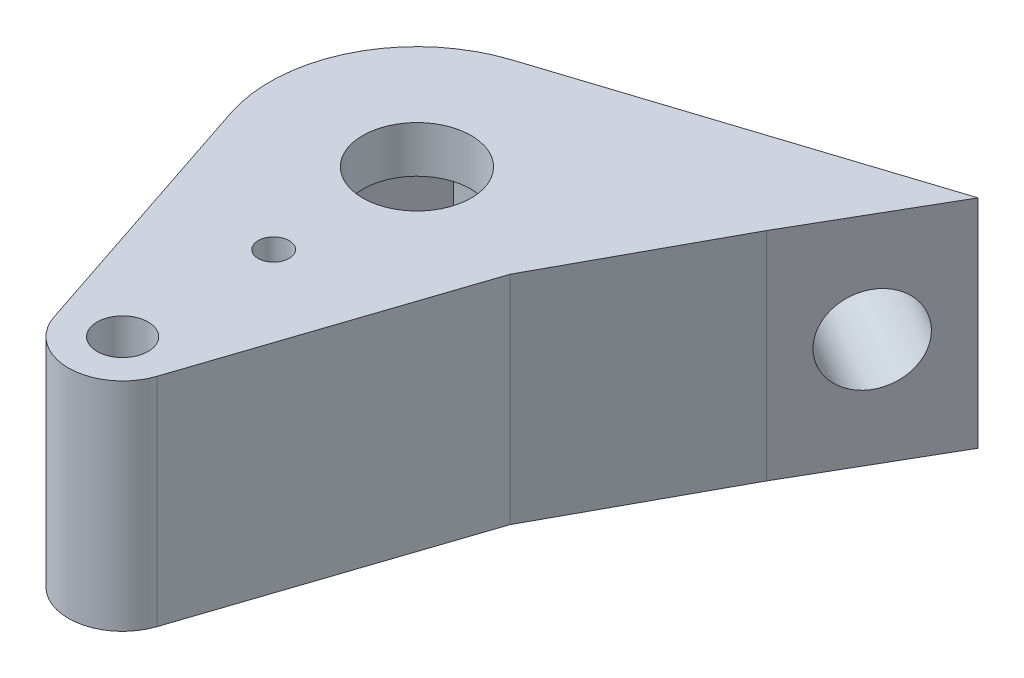
ISO-10303-21;
HEADER;
FILE_DESCRIPTION(('STEP AP214'),'2;1');
FILE_NAME('part.step','',(''),(''),'','','');
FILE_SCHEMA(('AUTOMOTIVE_DESIGN { 1 0 10303 214 1 1 1 1 }'));
ENDSEC;
DATA;
#1=APPLICATION_CONTEXT('core data for automotive mechanical design processes');
#2=APPLICATION_PROTOCOL_DEFINITION('international standard','automotive_design',2000,#1);
#3=PRODUCT_CONTEXT('',#1,'mechanical');
#4=PRODUCT('Part','Part','',(#3));
#5=PRODUCT_RELATED_PRODUCT_CATEGORY('part','',(#4));
#6=PRODUCT_DEFINITION_FORMATION('','',#4);
#7=PRODUCT_DEFINITION_CONTEXT('part definition',#1,'design');
#8=PRODUCT_DEFINITION('design','',#6,#7);
#9=PRODUCT_DEFINITION_SHAPE('','',#8);
#10=(LENGTH_UNIT() NAMED_UNIT(*) SI_UNIT(.MILLI.,.METRE.));
#11=(NAMED_UNIT(*) PLANE_ANGLE_UNIT() SI_UNIT($,.RADIAN.));
#12=(NAMED_UNIT(*) SI_UNIT($,.STERADIAN.) SOLID_ANGLE_UNIT());
#13=UNCERTAINTY_MEASURE_WITH_UNIT(LENGTH_MEASURE(1.E-05),#10,'distance_accuracy_value','');
#14=(GEOMETRIC_REPRESENTATION_CONTEXT(3) GLOBAL_UNCERTAINTY_ASSIGNED_CONTEXT((#13)) GLOBAL_UNIT_ASSIGNED_CONTEXT((#10,
#11,#12)) REPRESENTATION_CONTEXT('',''));
#15=CARTESIAN_POINT('',(0.,0.,0.));
#16=DIRECTION('',(0.,0.,1.));
#17=DIRECTION('',(1.,0.,0.));
#18=AXIS2_PLACEMENT_3D('',#15,#16,#17);
#19=CARTESIAN_POINT('',(0.,14.,-18.75));
#20=DIRECTION('',(0.,-1.,0.));
#21=DIRECTION('',(0.,0.,-1.));
#22=AXIS2_PLACEMENT_3D('',#19,#20,#21);
#23=CYLINDRICAL_SURFACE('',#22,1.);
#24=CARTESIAN_POINT('',(0.,14.,-18.75));
#25=DIRECTION('',(0.,1.,0.));
#26=DIRECTION('',(0.,0.,1.));
#27=AXIS2_PLACEMENT_3D('',#24,#25,#26);
#28=CIRCLE('',#27,1.);
#29=CARTESIAN_POINT('',(0.,14.,-17.75));
#30=VERTEX_POINT('',#29);
#31=EDGE_CURVE('E244',#30,#30,#28,.T.);
#32=ORIENTED_EDGE('',*,*,#31,.T.);
#33=EDGE_LOOP('',(#32));
#34=FACE_BOUND('',#33,.T.);
#35=CARTESIAN_POINT('',(0.,0.,-18.75));
#36=DIRECTION('',(0.,1.,0.));
#37=DIRECTION('',(0.,0.,1.));
#38=AXIS2_PLACEMENT_3D('',#35,#36,#37);
#39=CIRCLE('',#38,1.);
#40=CARTESIAN_POINT('',(0.,0.,-17.75));
#41=VERTEX_POINT('',#40);
#42=EDGE_CURVE('E247',#41,#41,#39,.T.);
#43=ORIENTED_EDGE('',*,*,#42,.F.);
#44=EDGE_LOOP('',(#43));
#45=FACE_BOUND('',#44,.T.);
#46=CARTESIAN_POINT('',(-0.300705799504268,8.73205080756888,-17.7962830492518));
#47=CARTESIAN_POINT('',(-0.325689996070135,8.73204560715963,-17.8041584912273));
#48=CARTESIAN_POINT('',(-0.35034909273251,8.73264583606228,-17.8130155199476));
#49=CARTESIAN_POINT('',(-0.398836042356316,8.73500666353457,-17.8326054373541));
#50=CARTESIAN_POINT('',(-0.422664396574327,8.73676654916548,-17.8433371705242));
#51=CARTESIAN_POINT('',(-0.492370233492586,8.74368070611668,-17.8780767802166));
#52=CARTESIAN_POINT('',(-0.536801699557979,8.75047082385879,-17.9047350611238));
#53=CARTESIAN_POINT('',(-0.62047026793531,8.76748638758361,-17.964093098129));
#54=CARTESIAN_POINT('',(-0.659717715065584,8.7777048433623,-17.9967805005877));
#55=CARTESIAN_POINT('',(-0.732528814921963,8.80040804540741,-18.0673749373079));
#56=CARTESIAN_POINT('',(-0.766083525729774,8.81289629440181,-18.1052900167418));
#57=CARTESIAN_POINT('',(-0.829461955250505,8.83997024460583,-18.1887864066669));
#58=CARTESIAN_POINT('',(-0.8587560633284,8.8546439549019,-18.2347410989531));
#59=CARTESIAN_POINT('',(-0.909549704299497,8.88372311011787,-18.330863528057));
#60=CARTESIAN_POINT('',(-0.931047124220398,8.89812848131355,-18.3810324024257));
#61=CARTESIAN_POINT('',(-0.966861891057181,8.92621470693834,-18.488131138555));
#62=CARTESIAN_POINT('',(-0.980596394408451,8.93978095819954,-18.5452887847199));
#63=CARTESIAN_POINT('',(-0.997840713747346,8.96350748441406,-18.6618176911083));
#64=CARTESIAN_POINT('',(-1.00135691241316,8.97366988201096,-18.7211875460302));
#65=CARTESIAN_POINT('',(-0.997830162807191,8.988804552762,-18.8359877111331));
#66=CARTESIAN_POINT('',(-0.991520854125792,8.99409471615473,-18.8913977004423));
#67=CARTESIAN_POINT('',(-0.969683926093178,9.00007582641124,-19.0006173700762));
#68=CARTESIAN_POINT('',(-0.954161740173439,9.00076948120356,-19.0544279740358));
#69=CARTESIAN_POINT('',(-0.916162517648001,8.99762980490607,-19.1540280424958));
#70=CARTESIAN_POINT('',(-0.894407649166108,8.9941848927311,-19.2001081079656));
#71=CARTESIAN_POINT('',(-0.844380234395861,8.98374231889361,-19.2881310817435));
#72=CARTESIAN_POINT('',(-0.81610732475216,8.97674445914197,-19.3300737592223));
#73=CARTESIAN_POINT('',(-0.753503173972858,8.95971589715707,-19.4094113808581));
#74=CARTESIAN_POINT('',(-0.719093513708405,8.94964456758859,-19.446735364114));
#75=CARTESIAN_POINT('',(-0.645422534654073,8.92737663794528,-19.5154875859152));
#76=CARTESIAN_POINT('',(-0.606159409817176,8.9151792460342,-19.5469136187238));
#77=CARTESIAN_POINT('',(-0.519733669081448,8.88844485919106,-19.6060797629524));
#78=CARTESIAN_POINT('',(-0.472175205580875,8.87379569933289,-19.6331914085517));
#79=CARTESIAN_POINT('',(-0.373230074335903,8.84454526337434,-19.6793454646563));
#80=CARTESIAN_POINT('',(-0.321840017300622,8.8299440418869,-19.6983806289989));
#81=CARTESIAN_POINT('',(-0.212831005686062,8.80143165596162,-19.7288295924018));
#82=CARTESIAN_POINT('',(-0.155023953401311,8.78762487792891,-19.7396760214373));
#83=CARTESIAN_POINT('',(-0.0377111981412017,8.76373998438613,-19.7510156246));
#84=CARTESIAN_POINT('',(0.0217900697548402,8.75365295265307,-19.7515337161523));
#85=CARTESIAN_POINT('',(0.118188488170374,8.74164806229026,-19.7436870182192));
#86=CARTESIAN_POINT('',(0.155169496554423,8.73808457362709,-19.7385901882888));
#87=CARTESIAN_POINT('',(0.228538587916785,8.73327051759961,-19.7242567576602));
#88=CARTESIAN_POINT('',(0.264925512373413,8.73202403336765,-19.715012884356));
#89=CARTESIAN_POINT('',(0.300705799504267,8.73205080756888,-19.7037169507482));
#90=B_SPLINE_CURVE_WITH_KNOTS('',3,(#46,#47,#48,#49,#50,#51,#52,#53,#54,#55,#56,#57,#58,#59,#60,
#61,#62,#63,#64,#65,#66,#67,#68,#69,#70,#71,#72,#73,#74,#75,#76,#77,#78,#79,#80,#81,#82,#83,#84,
#85,#86,#87,#88,#89),.UNSPECIFIED.,.F.,.F.,(4,2,2,2,2,2,2,2,2,2,2,2,2,2,2,2,2,2,2,2,2,4),(0.,
0.0785326222006874,0.157017008768958,0.312951858899485,0.46857067885041,0.624431719704137,
0.79304038253853,0.961694705745681,1.14173722727347,1.32166726431662,1.48879248123988,
1.65581923138171,1.80832142369327,1.96083211946322,2.11545319823069,2.27013198801097,
2.43941995018337,2.60885947680376,2.7891706621282,2.96904678850595,3.08126318733152,
3.19367715228912),.UNSPECIFIED.);
#91=CARTESIAN_POINT('',(-0.300705799504267,8.73205080756888,-17.7962830492518));
#92=VERTEX_POINT('',#91);
#93=CARTESIAN_POINT('',(0.300705799504268,8.73205080756888,-19.7037169507482));
#94=VERTEX_POINT('',#93);
#95=EDGE_CURVE('E64',#92,#94,#90,.T.);
#96=ORIENTED_EDGE('',*,*,#95,.T.);
#97=DIRECTION('',(0.,-1.,0.));
#98=VECTOR('',#97,1.);
#99=CARTESIAN_POINT('',(0.300705799504268,14.,-19.7037169507482));
#100=LINE('',#99,#98);
#101=CARTESIAN_POINT('',(0.300705799504268,5.26794919243112,-19.7037169507482));
#102=VERTEX_POINT('',#101);
#103=EDGE_CURVE('E12',#94,#102,#100,.T.);
#104=ORIENTED_EDGE('',*,*,#103,.T.);
#105=CARTESIAN_POINT('',(0.300705799504268,5.26794919243112,-19.7037169507482));
#106=CARTESIAN_POINT('',(0.275722775869407,5.26795439284037,-19.7115961127856));
#107=CARTESIAN_POINT('',(0.250443043458027,5.26735416393772,-19.7184847363903));
#108=CARTESIAN_POINT('',(0.19948854453796,5.26499333646543,-19.7302485872741));
#109=CARTESIAN_POINT('',(0.173814030200645,5.26323345083452,-19.7351250486055));
#110=CARTESIAN_POINT('',(0.0967885298625965,5.25631929388332,-19.7466496518406));
#111=CARTESIAN_POINT('',(0.0451018418423783,5.24952917614122,-19.7502973085059));
#112=CARTESIAN_POINT('',(-0.057481808320916,5.23251361241639,-19.7496643704326));
#113=CARTESIAN_POINT('',(-0.108380158686597,5.22229515663771,-19.7453998287469));
#114=CARTESIAN_POINT('',(-0.208514825421081,5.1995919545926,-19.7293349827745));
#115=CARTESIAN_POINT('',(-0.257748431520477,5.18710370559819,-19.7175229593948));
#116=CARTESIAN_POINT('',(-0.357556563407659,5.16002975539417,-19.6854790946429));
#117=CARTESIAN_POINT('',(-0.407911420560412,5.1453560450981,-19.6646376246294));
#118=CARTESIAN_POINT('',(-0.50465269573758,5.11627688988213,-19.6150327759044));
#119=CARTESIAN_POINT('',(-0.551038035388847,5.10187151868645,-19.5862672534146));
#120=CARTESIAN_POINT('',(-0.641805086265707,5.07378529306166,-19.5190796111045));
#121=CARTESIAN_POINT('',(-0.685840011760628,5.06021904180046,-19.4801365958891));
#122=CARTESIAN_POINT('',(-0.766803966057644,5.03649251558594,-19.3945726392359));
#123=CARTESIAN_POINT('',(-0.803737417195639,5.02633011798904,-19.3479565099078));
#124=CARTESIAN_POINT('',(-0.866695142638442,5.011195447238,-19.2518948595081));
#125=CARTESIAN_POINT('',(-0.893308723740223,5.00590528384527,-19.2028867827022));
#126=CARTESIAN_POINT('',(-0.938066788389363,4.99992417358876,-19.1008941196832));
#127=CARTESIAN_POINT('',(-0.956216252518446,4.99923051879645,-19.047911893361));
#128=CARTESIAN_POINT('',(-0.982217364032968,5.00237019509393,-18.9445288350304));
#129=CARTESIAN_POINT('',(-0.990827258781729,5.0058151072689,-18.8943041752628));
#130=CARTESIAN_POINT('',(-1.00033510331877,5.01625768110639,-18.7935054300644));
#131=CARTESIAN_POINT('',(-1.00123262306545,5.02325554085803,-18.7429313253059));
#132=CARTESIAN_POINT('',(-0.995456495260028,5.04028410284293,-18.6420334846492));
#133=CARTESIAN_POINT('',(-0.988677909017469,5.05035543241141,-18.5917228971536));
#134=CARTESIAN_POINT('',(-0.96776483029224,5.07262336205472,-18.4931484364873));
#135=CARTESIAN_POINT('',(-0.953627593223961,5.0848207539658,-18.4448853342442));
#136=CARTESIAN_POINT('',(-0.916768077180377,5.11155514080894,-18.3468474978665));
#137=CARTESIAN_POINT('',(-0.893361065647085,5.12620430066711,-18.2973605239368));
#138=CARTESIAN_POINT('',(-0.838782838138934,5.15545473662566,-18.2028007387527));
#139=CARTESIAN_POINT('',(-0.807604689591339,5.1700559581131,-18.1577319191899));
#140=CARTESIAN_POINT('',(-0.735774542800553,5.19856834403838,-18.07026458816));
#141=CARTESIAN_POINT('',(-0.694643033860512,5.21237512207109,-18.0282229505968));
#142=CARTESIAN_POINT('',(-0.605050179739718,5.23626001561387,-17.9516462593841));
#143=CARTESIAN_POINT('',(-0.556606759611163,5.24634704734694,-17.9170933384317));
#144=CARTESIAN_POINT('',(-0.47314111706229,5.25835193770975,-17.8682291157798));
#145=CARTESIAN_POINT('',(-0.439924626896421,5.26191542637291,-17.8511927594351));
#146=CARTESIAN_POINT('',(-0.371602867658686,5.26672948240039,-17.8208512364743));
#147=CARTESIAN_POINT('',(-0.336494376196765,5.26797596663235,-17.8075526917289));
#148=CARTESIAN_POINT('',(-0.300705799504267,5.26794919243112,-17.7962830492518));
#149=B_SPLINE_CURVE_WITH_KNOTS('',3,(#105,#106,#107,#108,#109,#110,#111,#112,#113,#114,#115,
#116,#117,#118,#119,#120,#121,#122,#123,#124,#125,#126,#127,#128,#129,#130,#131,#132,#133,#134,
#135,#136,#137,#138,#139,#140,#141,#142,#143,#144,#145,#146,#147,#148),.UNSPECIFIED.,.F.,.F.,(4,
2,2,2,2,2,2,2,2,2,2,2,2,2,2,2,2,2,2,2,2,4),(0.,0.0785326222006874,0.157017008768958,
0.312951858899485,0.468570678850407,0.624431719704135,0.793040382538526,0.961694705745679,
1.14173722727346,1.32166726431661,1.48879248123988,1.65581923138171,1.80832142369327,
1.96083211946322,2.11545319823069,2.27013198801097,2.43941995018337,2.60885947680376,
2.7891706621282,2.96904678850596,3.08126318733153,3.19367715228912),.UNSPECIFIED.);
#150=CARTESIAN_POINT('',(-0.300705799504267,5.26794919243112,-17.7962830492518));
#151=VERTEX_POINT('',#150);
#152=EDGE_CURVE('E180',#102,#151,#149,.T.);
#153=ORIENTED_EDGE('',*,*,#152,.T.);
#154=DIRECTION('',(0.,-1.,0.));
#155=VECTOR('',#154,1.);
#156=CARTESIAN_POINT('',(-0.300705799504267,14.,-17.7962830492518));
#157=LINE('',#156,#155);
#158=EDGE_CURVE('E183',#151,#92,#157,.F.);
#159=ORIENTED_EDGE('',*,*,#158,.T.);
#160=EDGE_LOOP('',(#96,#104,#153,#159));
#161=FACE_BOUND('',#160,.T.);
#162=ADVANCED_FACE('F55',(#34,#45,#161),#23,.F.);
#163=CARTESIAN_POINT('',(-6.40858798800484,14.,-28.));
#164=DIRECTION('',(0.866025403784439,0.,-0.5));
#165=DIRECTION('',(-0.5,0.,-0.866025403784439));
#166=AXIS2_PLACEMENT_3D('',#163,#164,#165);
#167=PLANE('',#166);
#168=DIRECTION('',(0.,-1.,0.));
#169=VECTOR('',#168,1.);
#170=CARTESIAN_POINT('',(-6.40858798800484,14.,-28.));
#171=LINE('',#170,#169);
#172=CARTESIAN_POINT('',(-6.40858798800484,11.,-28.));
#173=VERTEX_POINT('',#172);
#174=CARTESIAN_POINT('',(-6.40858798800484,0.,-28.));
#175=VERTEX_POINT('',#174);
#176=EDGE_CURVE('E274',#173,#175,#171,.T.);
#177=ORIENTED_EDGE('',*,*,#176,.F.);
#178=DIRECTION('',(0.5,0.,0.866025403784439));
#179=VECTOR('',#178,1.);
#180=CARTESIAN_POINT('',(-6.40858798800484,11.,-28.));
#181=LINE('',#180,#179);
#182=CARTESIAN_POINT('',(-3.20429399400243,11.,-22.45));
#183=VERTEX_POINT('',#182);
#184=EDGE_CURVE('E429',#173,#183,#181,.T.);
#185=ORIENTED_EDGE('',*,*,#184,.T.);
#186=DIRECTION('',(0.,-1.,0.));
#187=VECTOR('',#186,1.);
#188=CARTESIAN_POINT('',(-3.20429399400243,14.,-22.45));
#189=LINE('',#188,#187);
#190=CARTESIAN_POINT('',(-3.20429399400243,0.,-22.45));
#191=VERTEX_POINT('',#190);
#192=EDGE_CURVE('E284',#183,#191,#189,.T.);
#193=ORIENTED_EDGE('',*,*,#192,.T.);
#194=DIRECTION('',(0.5,0.,0.866025403784439));
#195=VECTOR('',#194,1.);
#196=CARTESIAN_POINT('',(-6.40858798800484,0.,-28.));
#197=LINE('',#196,#195);
#198=EDGE_CURVE('E251',#175,#191,#197,.T.);
#199=ORIENTED_EDGE('',*,*,#198,.F.);
#200=EDGE_LOOP('',(#177,#185,#193,#199));
#201=FACE_BOUND('',#200,.T.);
#202=ADVANCED_FACE('F233',(#201),#167,.T.);
#203=CARTESIAN_POINT('',(-3.20429399400243,14.,-22.45));
#204=DIRECTION('',(0.,0.,-1.));
#205=DIRECTION('',(-1.,0.,0.));
#206=AXIS2_PLACEMENT_3D('',#203,#204,#205);
#207=PLANE('',#206);
#208=ORIENTED_EDGE('',*,*,#192,.F.);
#209=DIRECTION('',(1.,0.,0.));
#210=VECTOR('',#209,1.);
#211=CARTESIAN_POINT('',(-3.20429399400243,11.,-22.45));
#212=LINE('',#211,#210);
#213=CARTESIAN_POINT('',(3.20429399400243,11.,-22.45));
#214=VERTEX_POINT('',#213);
#215=EDGE_CURVE('E433',#183,#214,#212,.T.);
#216=ORIENTED_EDGE('',*,*,#215,.T.);
#217=DIRECTION('',(0.,-1.,0.));
#218=VECTOR('',#217,1.);
#219=CARTESIAN_POINT('',(3.20429399400243,14.,-22.45));
#220=LINE('',#219,#218);
#221=CARTESIAN_POINT('',(3.20429399400243,0.,-22.45));
#222=VERTEX_POINT('',#221);
#223=EDGE_CURVE('E282',#214,#222,#220,.T.);
#224=ORIENTED_EDGE('',*,*,#223,.T.);
#225=DIRECTION('',(1.,0.,0.));
#226=VECTOR('',#225,1.);
#227=CARTESIAN_POINT('',(-3.20429399400243,0.,-22.45));
#228=LINE('',#227,#226);
#229=EDGE_CURVE('E259',#191,#222,#228,.T.);
#230=ORIENTED_EDGE('',*,*,#229,.F.);
#231=EDGE_LOOP('',(#208,#216,#224,#230));
#232=FACE_BOUND('',#231,.T.);
#233=ADVANCED_FACE('F238',(#232),#207,.T.);
#234=CARTESIAN_POINT('',(3.20429399400243,14.,-22.45));
#235=DIRECTION('',(-0.866025403784438,0.,-0.5));
#236=DIRECTION('',(-0.5,0.,0.866025403784439));
#237=AXIS2_PLACEMENT_3D('',#234,#235,#236);
#238=PLANE('',#237);
#239=ORIENTED_EDGE('',*,*,#223,.F.);
#240=DIRECTION('',(0.5,0.,-0.866025403784438));
#241=VECTOR('',#240,1.);
#242=CARTESIAN_POINT('',(3.20429399400243,11.,-22.45));
#243=LINE('',#242,#241);
#244=CARTESIAN_POINT('',(6.40858798800485,11.,-28.));
#245=VERTEX_POINT('',#244);
#246=EDGE_CURVE('E436',#214,#245,#243,.T.);
#247=ORIENTED_EDGE('',*,*,#246,.T.);
#248=DIRECTION('',(0.,-1.,0.));
#249=VECTOR('',#248,1.);
#250=CARTESIAN_POINT('',(6.40858798800485,14.,-28.));
#251=LINE('',#250,#249);
#252=CARTESIAN_POINT('',(6.40858798800485,0.,-28.));
#253=VERTEX_POINT('',#252);
#254=EDGE_CURVE('E280',#245,#253,#251,.T.);
#255=ORIENTED_EDGE('',*,*,#254,.T.);
#256=DIRECTION('',(0.5,0.,-0.866025403784438));
#257=VECTOR('',#256,1.);
#258=CARTESIAN_POINT('',(3.20429399400243,0.,-22.45));
#259=LINE('',#258,#257);
#260=EDGE_CURVE('E262',#222,#253,#259,.T.);
#261=ORIENTED_EDGE('',*,*,#260,.F.);
#262=EDGE_LOOP('',(#239,#247,#255,#261));
#263=FACE_BOUND('',#262,.T.);
#264=ADVANCED_FACE('F460',(#263),#238,.T.);
#265=CARTESIAN_POINT('',(6.40858798800485,14.,-28.));
#266=DIRECTION('',(-0.866025403784439,0.,0.5));
#267=DIRECTION('',(0.5,0.,0.866025403784439));
#268=AXIS2_PLACEMENT_3D('',#265,#266,#267);
#269=PLANE('',#268);
#270=ORIENTED_EDGE('',*,*,#254,.F.);
#271=DIRECTION('',(-0.5,0.,-0.866025403784439));
#272=VECTOR('',#271,1.);
#273=CARTESIAN_POINT('',(6.40858798800485,11.,-28.));
#274=LINE('',#273,#272);
#275=CARTESIAN_POINT('',(3.20429399400243,11.,-33.55));
#276=VERTEX_POINT('',#275);
#277=EDGE_CURVE('E439',#245,#276,#274,.T.);
#278=ORIENTED_EDGE('',*,*,#277,.T.);
#279=DIRECTION('',(0.,-1.,0.));
#280=VECTOR('',#279,1.);
#281=CARTESIAN_POINT('',(3.20429399400243,14.,-33.55));
#282=LINE('',#281,#280);
#283=CARTESIAN_POINT('',(3.20429399400243,0.,-33.55));
#284=VERTEX_POINT('',#283);
#285=EDGE_CURVE('E278',#276,#284,#282,.T.);
#286=ORIENTED_EDGE('',*,*,#285,.T.);
#287=DIRECTION('',(-0.5,0.,-0.866025403784439));
#288=VECTOR('',#287,1.);
#289=CARTESIAN_POINT('',(6.40858798800485,0.,-28.));
#290=LINE('',#289,#288);
#291=EDGE_CURVE('E265',#253,#284,#290,.T.);
#292=ORIENTED_EDGE('',*,*,#291,.F.);
#293=EDGE_LOOP('',(#270,#278,#286,#292));
#294=FACE_BOUND('',#293,.T.);
#295=ADVANCED_FACE('F457',(#294),#269,.T.);
#296=CARTESIAN_POINT('',(3.20429399400243,14.,-33.55));
#297=DIRECTION('',(0.,0.,1.));
#298=DIRECTION('',(1.,0.,0.));
#299=AXIS2_PLACEMENT_3D('',#296,#297,#298);
#300=PLANE('',#299);
#301=ORIENTED_EDGE('',*,*,#285,.F.);
#302=DIRECTION('',(-1.,0.,0.));
#303=VECTOR('',#302,1.);
#304=CARTESIAN_POINT('',(3.20429399400243,11.,-33.55));
#305=LINE('',#304,#303);
#306=CARTESIAN_POINT('',(-3.20429399400242,11.,-33.55));
#307=VERTEX_POINT('',#306);
#308=EDGE_CURVE('E254',#276,#307,#305,.T.);
#309=ORIENTED_EDGE('',*,*,#308,.T.);
#310=DIRECTION('',(0.,-1.,0.));
#311=VECTOR('',#310,1.);
#312=CARTESIAN_POINT('',(-3.20429399400242,14.,-33.55));
#313=LINE('',#312,#311);
#314=CARTESIAN_POINT('',(-3.20429399400242,0.,-33.55));
#315=VERTEX_POINT('',#314);
#316=EDGE_CURVE('E276',#307,#315,#313,.T.);
#317=ORIENTED_EDGE('',*,*,#316,.T.);
#318=DIRECTION('',(-1.,0.,0.));
#319=VECTOR('',#318,1.);
#320=CARTESIAN_POINT('',(3.20429399400243,0.,-33.55));
#321=LINE('',#320,#319);
#322=EDGE_CURVE('E268',#284,#315,#321,.T.);
#323=ORIENTED_EDGE('',*,*,#322,.F.);
#324=EDGE_LOOP('',(#301,#309,#317,#323));
#325=FACE_BOUND('',#324,.T.);
#326=ADVANCED_FACE('F446',(#325),#300,.T.);
#327=CARTESIAN_POINT('',(-3.20429399400242,14.,-33.55));
#328=DIRECTION('',(0.866025403784438,0.,0.5));
#329=DIRECTION('',(0.5,0.,-0.866025403784438));
#330=AXIS2_PLACEMENT_3D('',#327,#328,#329);
#331=PLANE('',#330);
#332=ORIENTED_EDGE('',*,*,#316,.F.);
#333=DIRECTION('',(-0.5,0.,0.866025403784438));
#334=VECTOR('',#333,1.);
#335=CARTESIAN_POINT('',(-3.20429399400242,11.,-33.55));
#336=LINE('',#335,#334);
#337=EDGE_CURVE('E249',#307,#173,#336,.T.);
#338=ORIENTED_EDGE('',*,*,#337,.T.);
#339=ORIENTED_EDGE('',*,*,#176,.T.);
#340=DIRECTION('',(-0.5,0.,0.866025403784438));
#341=VECTOR('',#340,1.);
#342=CARTESIAN_POINT('',(-3.20429399400242,0.,-33.55));
#343=LINE('',#342,#341);
#344=EDGE_CURVE('E271',#315,#175,#343,.T.);
#345=ORIENTED_EDGE('',*,*,#344,.F.);
#346=EDGE_LOOP('',(#332,#338,#339,#345));
#347=FACE_BOUND('',#346,.T.);
#348=ADVANCED_FACE('F450',(#347),#331,.T.);
#349=CARTESIAN_POINT('',(0.,14.,-28.));
#350=DIRECTION('',(0.,1.,0.));
#351=DIRECTION('',(0.,0.,1.));
#352=AXIS2_PLACEMENT_3D('',#349,#350,#351);
#353=PLANE('',#352);
#354=CARTESIAN_POINT('',(0.,14.,-9.));
#355=DIRECTION('',(0.,1.,0.));
#356=DIRECTION('',(0.,0.,1.));
#357=AXIS2_PLACEMENT_3D('',#354,#355,#356);
#358=CIRCLE('',#357,1.65);
#359=CARTESIAN_POINT('',(0.,14.,-7.35));
#360=VERTEX_POINT('',#359);
#361=EDGE_CURVE('E287',#360,#360,#358,.T.);
#362=ORIENTED_EDGE('',*,*,#361,.F.);
#363=EDGE_LOOP('',(#362));
#364=FACE_BOUND('',#363,.T.);
#365=CARTESIAN_POINT('',(0.,14.,-28.));
#366=DIRECTION('',(0.,1.,0.));
#367=DIRECTION('',(0.,0.,1.));
#368=AXIS2_PLACEMENT_3D('',#365,#366,#367);
#369=CIRCLE('',#368,9.5);
#370=CARTESIAN_POINT('',(-2.91305715173362,14.,-37.0423502492844));
#371=VERTEX_POINT('',#370);
#372=CARTESIAN_POINT('',(-9.01387818865998,14.,-25.));
#373=VERTEX_POINT('',#372);
#374=EDGE_CURVE('E293',#371,#373,#369,.T.);
#375=ORIENTED_EDGE('',*,*,#374,.T.);
#376=DIRECTION('',(0.315789473684211,0.,0.948829283016839));
#377=VECTOR('',#376,1.);
#378=CARTESIAN_POINT('',(-9.01387818865998,14.,-25.));
#379=LINE('',#378,#377);
#380=CARTESIAN_POINT('',(-3.32090249055894,14.,-7.89473684210526));
#381=VERTEX_POINT('',#380);
#382=EDGE_CURVE('E296',#373,#381,#379,.T.);
#383=ORIENTED_EDGE('',*,*,#382,.T.);
#384=CARTESIAN_POINT('',(0.,14.,-9.));
#385=DIRECTION('',(0.,1.,0.));
#386=DIRECTION('',(0.,0.,1.));
#387=AXIS2_PLACEMENT_3D('',#384,#385,#386);
#388=CIRCLE('',#387,3.5);
#389=CARTESIAN_POINT('',(3.32090249055894,14.,-7.89473684210526));
#390=VERTEX_POINT('',#389);
#391=EDGE_CURVE('E299',#381,#390,#388,.T.);
#392=ORIENTED_EDGE('',*,*,#391,.T.);
#393=DIRECTION('',(0.315789473684211,0.,-0.948829283016839));
#394=VECTOR('',#393,1.);
#395=CARTESIAN_POINT('',(9.01387818865998,14.,-25.));
#396=LINE('',#395,#394);
#397=CARTESIAN_POINT('',(9.01387818865998,14.,-25.));
#398=VERTEX_POINT('',#397);
#399=EDGE_CURVE('E301',#390,#398,#396,.T.);
#400=ORIENTED_EDGE('',*,*,#399,.T.);
#401=DIRECTION('',(0.478100744684265,0.,-0.878305002793649));
#402=VECTOR('',#401,1.);
#403=CARTESIAN_POINT('',(9.01387818865998,14.,-25.));
#404=LINE('',#403,#402);
#405=CARTESIAN_POINT('',(14.8460434894692,14.,-35.7141016151378));
#406=VERTEX_POINT('',#405);
#407=EDGE_CURVE('E303',#398,#406,#404,.T.);
#408=ORIENTED_EDGE('',*,*,#407,.T.);
#409=DIRECTION('',(0.5,0.,-0.866025403784439));
#410=VECTOR('',#409,1.);
#411=CARTESIAN_POINT('',(14.8460434894692,14.,-35.7141016151378));
#412=LINE('',#411,#410);
#413=CARTESIAN_POINT('',(19.8460434894692,14.,-44.3743556529822));
#414=VERTEX_POINT('',#413);
#415=EDGE_CURVE('E305',#406,#414,#412,.T.);
#416=ORIENTED_EDGE('',*,*,#415,.T.);
#417=DIRECTION('',(-0.951826342029936,0.,0.306637594919329));
#418=VECTOR('',#417,1.);
#419=CARTESIAN_POINT('',(19.8460434894692,14.,-44.3743556529822));
#420=LINE('',#419,#418);
#421=EDGE_CURVE('E307',#414,#371,#420,.T.);
#422=ORIENTED_EDGE('',*,*,#421,.T.);
#423=EDGE_LOOP('',(#375,#383,#392,#400,#408,#416,#422));
#424=FACE_BOUND('',#423,.T.);
#425=ORIENTED_EDGE('',*,*,#31,.F.);
#426=EDGE_LOOP('',(#425));
#427=FACE_BOUND('',#426,.T.);
#428=CARTESIAN_POINT('',(0.,14.,-28.));
#429=DIRECTION('',(0.,1.,0.));
#430=DIRECTION('',(0.,0.,1.));
#431=AXIS2_PLACEMENT_3D('',#428,#429,#430);
#432=CIRCLE('',#431,3.5);
#433=CARTESIAN_POINT('',(0.,14.,-24.5));
#434=VERTEX_POINT('',#433);
#435=EDGE_CURVE('E419',#434,#434,#432,.T.);
#436=ORIENTED_EDGE('',*,*,#435,.F.);
#437=EDGE_LOOP('',(#436));
#438=FACE_BOUND('',#437,.T.);
#439=ADVANCED_FACE('F388',(#364,#424,#427,#438),#353,.T.);
#440=CARTESIAN_POINT('',(0.,0.,-28.));
#441=DIRECTION('',(0.,1.,0.));
#442=DIRECTION('',(0.,0.,1.));
#443=AXIS2_PLACEMENT_3D('',#440,#441,#442);
#444=PLANE('',#443);
#445=CARTESIAN_POINT('',(0.,0.,-9.));
#446=DIRECTION('',(0.,1.,0.));
#447=DIRECTION('',(0.,0.,1.));
#448=AXIS2_PLACEMENT_3D('',#445,#446,#447);
#449=CIRCLE('',#448,1.65);
#450=CARTESIAN_POINT('',(0.,0.,-7.35));
#451=VERTEX_POINT('',#450);
#452=EDGE_CURVE('E286',#451,#451,#449,.T.);
#453=ORIENTED_EDGE('',*,*,#452,.T.);
#454=EDGE_LOOP('',(#453));
#455=FACE_BOUND('',#454,.T.);
#456=CARTESIAN_POINT('',(0.,0.,-28.));
#457=DIRECTION('',(0.,1.,0.));
#458=DIRECTION('',(0.,0.,1.));
#459=AXIS2_PLACEMENT_3D('',#456,#457,#458);
#460=CIRCLE('',#459,9.5);
#461=CARTESIAN_POINT('',(-2.91305715173362,0.,-37.0423502492844));
#462=VERTEX_POINT('',#461);
#463=CARTESIAN_POINT('',(-9.01387818865998,0.,-25.));
#464=VERTEX_POINT('',#463);
#465=EDGE_CURVE('E290',#462,#464,#460,.T.);
#466=ORIENTED_EDGE('',*,*,#465,.F.);
#467=DIRECTION('',(-0.951826342029936,0.,0.306637594919329));
#468=VECTOR('',#467,1.);
#469=CARTESIAN_POINT('',(19.8460434894692,0.,-44.3743556529822));
#470=LINE('',#469,#468);
#471=CARTESIAN_POINT('',(19.8460434894692,0.,-44.3743556529822));
#472=VERTEX_POINT('',#471);
#473=EDGE_CURVE('E297',#472,#462,#470,.T.);
#474=ORIENTED_EDGE('',*,*,#473,.F.);
#475=DIRECTION('',(0.5,0.,-0.866025403784439));
#476=VECTOR('',#475,1.);
#477=CARTESIAN_POINT('',(14.8460434894692,0.,-35.7141016151378));
#478=LINE('',#477,#476);
#479=CARTESIAN_POINT('',(14.8460434894692,0.,-35.7141016151378));
#480=VERTEX_POINT('',#479);
#481=EDGE_CURVE('E320',#480,#472,#478,.T.);
#482=ORIENTED_EDGE('',*,*,#481,.F.);
#483=DIRECTION('',(0.478100744684265,0.,-0.878305002793649));
#484=VECTOR('',#483,1.);
#485=CARTESIAN_POINT('',(9.01387818865998,0.,-25.));
#486=LINE('',#485,#484);
#487=CARTESIAN_POINT('',(9.01387818865998,0.,-25.));
#488=VERTEX_POINT('',#487);
#489=EDGE_CURVE('E318',#488,#480,#486,.T.);
#490=ORIENTED_EDGE('',*,*,#489,.F.);
#491=DIRECTION('',(0.315789473684211,0.,-0.948829283016839));
#492=VECTOR('',#491,1.);
#493=CARTESIAN_POINT('',(9.01387818865998,0.,-25.));
#494=LINE('',#493,#492);
#495=CARTESIAN_POINT('',(3.32090249055894,0.,-7.89473684210526));
#496=VERTEX_POINT('',#495);
#497=EDGE_CURVE('E316',#496,#488,#494,.T.);
#498=ORIENTED_EDGE('',*,*,#497,.F.);
#499=CARTESIAN_POINT('',(0.,0.,-9.));
#500=DIRECTION('',(0.,1.,0.));
#501=DIRECTION('',(0.,0.,1.));
#502=AXIS2_PLACEMENT_3D('',#499,#500,#501);
#503=CIRCLE('',#502,3.5);
#504=CARTESIAN_POINT('',(-3.32090249055894,0.,-7.89473684210526));
#505=VERTEX_POINT('',#504);
#506=EDGE_CURVE('E314',#505,#496,#503,.T.);
#507=ORIENTED_EDGE('',*,*,#506,.F.);
#508=DIRECTION('',(0.315789473684211,0.,0.948829283016839));
#509=VECTOR('',#508,1.);
#510=CARTESIAN_POINT('',(-9.01387818865998,0.,-25.));
#511=LINE('',#510,#509);
#512=EDGE_CURVE('E312',#464,#505,#511,.T.);
#513=ORIENTED_EDGE('',*,*,#512,.F.);
#514=EDGE_LOOP('',(#466,#474,#482,#490,#498,#507,#513));
#515=FACE_BOUND('',#514,.T.);
#516=ORIENTED_EDGE('',*,*,#198,.T.);
#517=ORIENTED_EDGE('',*,*,#229,.T.);
#518=ORIENTED_EDGE('',*,*,#260,.T.);
#519=ORIENTED_EDGE('',*,*,#291,.T.);
#520=ORIENTED_EDGE('',*,*,#322,.T.);
#521=ORIENTED_EDGE('',*,*,#344,.T.);
#522=EDGE_LOOP('',(#516,#517,#518,#519,#520,#521));
#523=FACE_BOUND('',#522,.T.);
#524=ORIENTED_EDGE('',*,*,#42,.T.);
#525=EDGE_LOOP('',(#524));
#526=FACE_BOUND('',#525,.T.);
#527=ADVANCED_FACE('F362',(#455,#515,#523,#526),#444,.F.);
#528=CARTESIAN_POINT('',(0.,14.,-28.));
#529=DIRECTION('',(0.,-1.,0.));
#530=DIRECTION('',(0.,0.,-1.));
#531=AXIS2_PLACEMENT_3D('',#528,#529,#530);
#532=CYLINDRICAL_SURFACE('',#531,9.5);
#533=ORIENTED_EDGE('',*,*,#465,.T.);
#534=DIRECTION('',(0.,-1.,0.));
#535=VECTOR('',#534,1.);
#536=CARTESIAN_POINT('',(-9.01387818865998,14.,-25.));
#537=LINE('',#536,#535);
#538=EDGE_CURVE('E340',#373,#464,#537,.T.);
#539=ORIENTED_EDGE('',*,*,#538,.F.);
#540=ORIENTED_EDGE('',*,*,#374,.F.);
#541=DIRECTION('',(0.,-1.,0.));
#542=VECTOR('',#541,1.);
#543=CARTESIAN_POINT('',(-2.91305715173362,14.,-37.0423502492844));
#544=LINE('',#543,#542);
#545=EDGE_CURVE('E309',#371,#462,#544,.T.);
#546=ORIENTED_EDGE('',*,*,#545,.T.);
#547=EDGE_LOOP('',(#533,#539,#540,#546));
#548=FACE_BOUND('',#547,.T.);
#549=ADVANCED_FACE('F381',(#548),#532,.T.);
#550=CARTESIAN_POINT('',(-9.01387818865998,14.,-25.));
#551=DIRECTION('',(0.948829283016839,0.,-0.315789473684211));
#552=DIRECTION('',(-0.315789473684211,0.,-0.948829283016839));
#553=AXIS2_PLACEMENT_3D('',#550,#551,#552);
#554=PLANE('',#553);
#555=CARTESIAN_POINT('',(-7.74667089970317,7.,-21.1925159525204));
#556=DIRECTION('',(0.948829283016839,0.,-0.315789473684211));
#557=DIRECTION('',(0.315789473684211,0.,0.948829283016839));
#558=AXIS2_PLACEMENT_3D('',#555,#556,#557);
#559=ELLIPSE('',#558,2.46927345861073,2.);
#560=CARTESIAN_POINT('',(-6.96690033382609,7.,-18.8495969872143));
#561=VERTEX_POINT('',#560);
#562=EDGE_CURVE('E181',#561,#561,#559,.F.);
#563=ORIENTED_EDGE('',*,*,#562,.F.);
#564=EDGE_LOOP('',(#563));
#565=FACE_BOUND('',#564,.T.);
#566=ORIENTED_EDGE('',*,*,#512,.T.);
#567=DIRECTION('',(0.,-1.,0.));
#568=VECTOR('',#567,1.);
#569=CARTESIAN_POINT('',(-3.32090249055894,14.,-7.89473684210526));
#570=LINE('',#569,#568);
#571=EDGE_CURVE('E337',#381,#505,#570,.T.);
#572=ORIENTED_EDGE('',*,*,#571,.F.);
#573=ORIENTED_EDGE('',*,*,#382,.F.);
#574=ORIENTED_EDGE('',*,*,#538,.T.);
#575=EDGE_LOOP('',(#566,#572,#573,#574));
#576=FACE_BOUND('',#575,.T.);
#577=ADVANCED_FACE('F378',(#565,#576),#554,.F.);
#578=CARTESIAN_POINT('',(0.,14.,-9.));
#579=DIRECTION('',(0.,-1.,0.));
#580=DIRECTION('',(0.,0.,-1.));
#581=AXIS2_PLACEMENT_3D('',#578,#579,#580);
#582=CYLINDRICAL_SURFACE('',#581,3.5);
#583=ORIENTED_EDGE('',*,*,#506,.T.);
#584=DIRECTION('',(0.,-1.,0.));
#585=VECTOR('',#584,1.);
#586=CARTESIAN_POINT('',(3.32090249055894,14.,-7.89473684210526));
#587=LINE('',#586,#585);
#588=EDGE_CURVE('E334',#390,#496,#587,.T.);
#589=ORIENTED_EDGE('',*,*,#588,.F.);
#590=ORIENTED_EDGE('',*,*,#391,.F.);
#591=ORIENTED_EDGE('',*,*,#571,.T.);
#592=EDGE_LOOP('',(#583,#589,#590,#591));
#593=FACE_BOUND('',#592,.T.);
#594=ADVANCED_FACE('F374',(#593),#582,.T.);
#595=CARTESIAN_POINT('',(9.01387818865998,14.,-25.));
#596=DIRECTION('',(-0.948829283016839,0.,-0.315789473684211));
#597=DIRECTION('',(-0.315789473684211,0.,0.948829283016839));
#598=AXIS2_PLACEMENT_3D('',#595,#596,#597);
#599=PLANE('',#598);
#600=ORIENTED_EDGE('',*,*,#497,.T.);
#601=DIRECTION('',(0.,-1.,0.));
#602=VECTOR('',#601,1.);
#603=CARTESIAN_POINT('',(9.01387818865998,14.,-25.));
#604=LINE('',#603,#602);
#605=EDGE_CURVE('E331',#398,#488,#604,.T.);
#606=ORIENTED_EDGE('',*,*,#605,.F.);
#607=ORIENTED_EDGE('',*,*,#399,.F.);
#608=ORIENTED_EDGE('',*,*,#588,.T.);
#609=EDGE_LOOP('',(#600,#606,#607,#608));
#610=FACE_BOUND('',#609,.T.);
#611=ADVANCED_FACE('F370',(#610),#599,.F.);
#612=CARTESIAN_POINT('',(9.01387818865998,14.,-25.));
#613=DIRECTION('',(-0.878305002793649,0.,-0.478100744684265));
#614=DIRECTION('',(-0.478100744684265,0.,0.878305002793649));
#615=AXIS2_PLACEMENT_3D('',#612,#613,#614);
#616=PLANE('',#615);
#617=ORIENTED_EDGE('',*,*,#489,.T.);
#618=DIRECTION('',(0.,-1.,0.));
#619=VECTOR('',#618,1.);
#620=CARTESIAN_POINT('',(14.8460434894692,14.,-35.7141016151378));
#621=LINE('',#620,#619);
#622=EDGE_CURVE('E328',#406,#480,#621,.T.);
#623=ORIENTED_EDGE('',*,*,#622,.F.);
#624=ORIENTED_EDGE('',*,*,#407,.F.);
#625=ORIENTED_EDGE('',*,*,#605,.T.);
#626=EDGE_LOOP('',(#617,#623,#624,#625));
#627=FACE_BOUND('',#626,.T.);
#628=ADVANCED_FACE('F366',(#627),#616,.F.);
#629=CARTESIAN_POINT('',(14.8460434894692,14.,-35.7141016151378));
#630=DIRECTION('',(-0.866025403784439,0.,-0.5));
#631=DIRECTION('',(-0.5,0.,0.866025403784439));
#632=AXIS2_PLACEMENT_3D('',#629,#630,#631);
#633=PLANE('',#632);
#634=ORIENTED_EDGE('',*,*,#481,.T.);
#635=DIRECTION('',(0.,-1.,0.));
#636=VECTOR('',#635,1.);
#637=CARTESIAN_POINT('',(19.8460434894692,14.,-44.3743556529822));
#638=LINE('',#637,#636);
#639=EDGE_CURVE('E325',#414,#472,#638,.T.);
#640=ORIENTED_EDGE('',*,*,#639,.F.);
#641=ORIENTED_EDGE('',*,*,#415,.F.);
#642=ORIENTED_EDGE('',*,*,#622,.T.);
#643=EDGE_LOOP('',(#634,#640,#641,#642));
#644=FACE_BOUND('',#643,.T.);
#645=CARTESIAN_POINT('',(17.3460434894692,7.,-40.04422863406));
#646=DIRECTION('',(0.866025403784439,0.,0.5));
#647=DIRECTION('',(0.5,0.,-0.866025403784439));
#648=AXIS2_PLACEMENT_3D('',#645,#646,#647);
#649=CIRCLE('',#648,2.8);
#650=CARTESIAN_POINT('',(18.7460434894692,7.,-42.4690997646564));
#651=VERTEX_POINT('',#650);
#652=EDGE_CURVE('E418',#651,#651,#649,.T.);
#653=ORIENTED_EDGE('',*,*,#652,.F.);
#654=EDGE_LOOP('',(#653));
#655=FACE_BOUND('',#654,.T.);
#656=ADVANCED_FACE('F360',(#644,#655),#633,.F.);
#657=CARTESIAN_POINT('',(19.8460434894692,14.,-44.3743556529822));
#658=DIRECTION('',(0.306637594919329,0.,0.951826342029937));
#659=DIRECTION('',(0.951826342029937,0.,-0.306637594919329));
#660=AXIS2_PLACEMENT_3D('',#657,#658,#659);
#661=PLANE('',#660);
#662=CARTESIAN_POINT('',(13.4275270674012,7.,-42.3065851451649));
#663=DIRECTION('',(0.306637594919329,0.,0.951826342029937));
#664=DIRECTION('',(0.951826342029937,0.,-0.306637594919329));
#665=AXIS2_PLACEMENT_3D('',#662,#663,#664);
#666=ELLIPSE('',#665,6.0690322643744,4.5);
#667=CARTESIAN_POINT('',(9.91621705982906,3.4267452941026,-41.1753917665052));
#668=VERTEX_POINT('',#667);
#669=CARTESIAN_POINT('',(9.91621705982906,10.5732547058974,-41.1753917665052));
#670=VERTEX_POINT('',#669);
#671=EDGE_CURVE('E343',#668,#670,#666,.T.);
#672=ORIENTED_EDGE('',*,*,#671,.T.);
#673=CARTESIAN_POINT('',(9.91621705982906,10.5732547058974,-41.1753917665052));
#674=CARTESIAN_POINT('',(9.86727356053504,10.5440578656,-41.1596242716926));
#675=CARTESIAN_POINT('',(9.81968012973652,10.5124730730239,-41.1442917110042));
#676=CARTESIAN_POINT('',(9.72734929197082,10.445120115962,-41.114546677925));
#677=CARTESIAN_POINT('',(9.68260789926285,10.4093579966367,-41.1001329214995));
#678=CARTESIAN_POINT('',(9.55323431409705,10.2970272969273,-41.0584543050864));
#679=CARTESIAN_POINT('',(9.47283747931392,10.2150345591595,-41.0325538955596));
#680=CARTESIAN_POINT('',(9.29717367427934,10.0089067840806,-40.9759625570857));
#681=CARTESIAN_POINT('',(9.20683820894298,9.88017438976396,-40.9468603473616));
#682=CARTESIAN_POINT('',(9.04693112332195,9.60904063610605,-40.8953451476028));
#683=CARTESIAN_POINT('',(8.97740984201149,9.46660722172791,-40.872948374625));
#684=CARTESIAN_POINT('',(8.87290359188668,9.21078951221872,-40.8392809462536));
#685=CARTESIAN_POINT('',(8.83363293201316,9.09927993384336,-40.826629625143));
#686=CARTESIAN_POINT('',(8.76466998185539,8.87302662730223,-40.804412722499));
#687=CARTESIAN_POINT('',(8.73498059367815,8.75828193066148,-40.7948480758998));
#688=CARTESIAN_POINT('',(8.68386575207662,8.52627686108931,-40.77838106779));
#689=CARTESIAN_POINT('',(8.66247834864233,8.40900744592437,-40.7714909643529));
#690=CARTESIAN_POINT('',(8.62677824746174,8.17332960878639,-40.7599899240045));
#691=CARTESIAN_POINT('',(8.61246477003323,8.05492131380699,-40.7553787359129));
#692=CARTESIAN_POINT('',(8.59186599507082,7.84176284827377,-40.7487426947215));
#693=CARTESIAN_POINT('',(8.58453824156391,7.74711835486682,-40.7463820070495));
#694=CARTESIAN_POINT('',(8.57286415131237,7.55762494871309,-40.7426211162236));
#695=CARTESIAN_POINT('',(8.56851799389223,7.46277602401513,-40.7412209708404));
#696=CARTESIAN_POINT('',(8.56234417430013,7.27290563437736,-40.7392320311488));
#697=CARTESIAN_POINT('',(8.56051879525797,7.17788409097215,-40.7386439723668));
#698=CARTESIAN_POINT('',(8.55917099176144,6.98782783018541,-40.7382097679281));
#699=CARTESIAN_POINT('',(8.55964848862217,6.89279311336493,-40.7383635969224));
#700=CARTESIAN_POINT('',(8.56296094826963,6.70306511298871,-40.7394307292497));
#701=CARTESIAN_POINT('',(8.56578842417512,6.6083717030714,-40.7403416206309));
#702=CARTESIAN_POINT('',(8.57412063195962,6.41911968395357,-40.7430259003599));
#703=CARTESIAN_POINT('',(8.579625507021,6.32456108223361,-40.7447993348349));
#704=CARTESIAN_POINT('',(8.60092620759274,6.04148120332236,-40.7516615063309));
#705=CARTESIAN_POINT('',(8.6215102538616,5.85326592531171,-40.7582928025693));
#706=CARTESIAN_POINT('',(8.6654622607679,5.57676075304996,-40.77245225277));
#707=CARTESIAN_POINT('',(8.68185633852347,5.48724619634861,-40.7777337209873));
#708=CARTESIAN_POINT('',(8.71947494678883,5.30934138236924,-40.789852821976));
#709=CARTESIAN_POINT('',(8.74069992275084,5.22095122956547,-40.7966905982528));
#710=CARTESIAN_POINT('',(8.8125274830114,4.95810582116986,-40.8198303553227));
#711=CARTESIAN_POINT('',(8.87128650813352,4.78594918195241,-40.8387599912737));
#712=CARTESIAN_POINT('',(9.01540894370482,4.45090645554567,-40.8851900542653));
#713=CARTESIAN_POINT('',(9.1011717313965,4.28820608672881,-40.912819143512));
#714=CARTESIAN_POINT('',(9.30119311603682,3.98385692816245,-40.9772574487051));
#715=CARTESIAN_POINT('',(9.41530010162002,3.84210233598847,-41.0140178219767));
#716=CARTESIAN_POINT('',(9.6154662008388,3.64619728119394,-41.0785027479958));
#717=CARTESIAN_POINT('',(9.69172837953752,3.580968788453,-41.1030711487921));
#718=CARTESIAN_POINT('',(9.81271831320241,3.4925541537384,-41.1420489125188));
#719=CARTESIAN_POINT('',(9.85429074739472,3.4645800900453,-41.1554417665225));
#720=CARTESIAN_POINT('',(9.93953197756164,3.41226979842805,-41.18290283232));
#721=CARTESIAN_POINT('',(9.98320357778045,3.38793862606246,-41.196971947521));
#722=CARTESIAN_POINT('',(10.0278456184527,3.36566362334397,-41.2113536969847));
#723=B_SPLINE_CURVE_WITH_KNOTS('',3,(#673,#674,#675,#676,#677,#678,#679,#680,#681,#682,#683,
#684,#685,#686,#687,#688,#689,#690,#691,#692,#693,#694,#695,#696,#697,#698,#699,#700,#701,#702,
#703,#704,#705,#706,#707,#708,#709,#710,#711,#712,#713,#714,#715,#716,#717,#718,#719,#720,#721,
#722),.UNSPECIFIED.,.F.,.F.,(4,2,2,2,2,2,2,2,2,2,2,2,2,2,2,2,2,2,2,2,2,2,2,2,4),(0.,
0.177242004994258,0.35423062230973,0.705987004929395,1.18326786164972,1.66169386400328,
2.01789648793947,2.37420690236857,2.73213161646166,3.09001687158887,3.37483181608573,
3.65966388893199,3.94475377223398,4.22983391462691,4.51400927618113,4.79819983658237,
5.36571241716637,5.63905059491841,5.91241398712422,6.45906109313111,7.01420607144285,
7.5664432518522,7.87533864262091,8.03077944063438,8.18643399677256),.UNSPECIFIED.);
#724=EDGE_CURVE('E350',#670,#668,#723,.T.);
#725=ORIENTED_EDGE('',*,*,#724,.T.);
#726=EDGE_LOOP('',(#672,#725));
#727=FACE_BOUND('',#726,.T.);
#728=ORIENTED_EDGE('',*,*,#473,.T.);
#729=ORIENTED_EDGE('',*,*,#545,.F.);
#730=ORIENTED_EDGE('',*,*,#421,.F.);
#731=ORIENTED_EDGE('',*,*,#639,.T.);
#732=EDGE_LOOP('',(#728,#729,#730,#731));
#733=FACE_BOUND('',#732,.T.);
#734=ADVANCED_FACE('F227',(#727,#733),#661,.F.);
#735=CARTESIAN_POINT('',(0.,14.,-9.));
#736=DIRECTION('',(0.,-1.,0.));
#737=DIRECTION('',(0.,0.,-1.));
#738=AXIS2_PLACEMENT_3D('',#735,#736,#737);
#739=CYLINDRICAL_SURFACE('',#738,1.65);
#740=ORIENTED_EDGE('',*,*,#361,.T.);
#741=EDGE_LOOP('',(#740));
#742=FACE_BOUND('',#741,.T.);
#743=ORIENTED_EDGE('',*,*,#452,.F.);
#744=EDGE_LOOP('',(#743));
#745=FACE_BOUND('',#744,.T.);
#746=ADVANCED_FACE('F222',(#742,#745),#739,.F.);
#747=CARTESIAN_POINT('',(0.,11.,0.));
#748=DIRECTION('',(0.,1.,0.));
#749=DIRECTION('',(0.,0.,1.));
#750=AXIS2_PLACEMENT_3D('',#747,#748,#749);
#751=PLANE('',#750);
#752=CARTESIAN_POINT('',(0.,11.,-28.));
#753=DIRECTION('',(0.,1.,0.));
#754=DIRECTION('',(0.,0.,1.));
#755=AXIS2_PLACEMENT_3D('',#752,#753,#754);
#756=CIRCLE('',#755,3.5);
#757=CARTESIAN_POINT('',(0.,11.,-24.5));
#758=VERTEX_POINT('',#757);
#759=EDGE_CURVE('E423',#758,#758,#756,.T.);
#760=ORIENTED_EDGE('',*,*,#759,.T.);
#761=EDGE_LOOP('',(#760));
#762=FACE_BOUND('',#761,.T.);
#763=ORIENTED_EDGE('',*,*,#184,.F.);
#764=ORIENTED_EDGE('',*,*,#337,.F.);
#765=ORIENTED_EDGE('',*,*,#308,.F.);
#766=ORIENTED_EDGE('',*,*,#277,.F.);
#767=ORIENTED_EDGE('',*,*,#246,.F.);
#768=ORIENTED_EDGE('',*,*,#215,.F.);
#769=EDGE_LOOP('',(#763,#764,#765,#766,#767,#768));
#770=FACE_BOUND('',#769,.T.);
#771=ADVANCED_FACE('F219',(#762,#770),#751,.F.);
#772=CARTESIAN_POINT('',(0.,11.,-28.));
#773=DIRECTION('',(0.,1.,0.));
#774=DIRECTION('',(0.,0.,1.));
#775=AXIS2_PLACEMENT_3D('',#772,#773,#774);
#776=CYLINDRICAL_SURFACE('',#775,3.5);
#777=ORIENTED_EDGE('',*,*,#759,.F.);
#778=EDGE_LOOP('',(#777));
#779=FACE_BOUND('',#778,.T.);
#780=ORIENTED_EDGE('',*,*,#435,.T.);
#781=EDGE_LOOP('',(#780));
#782=FACE_BOUND('',#781,.T.);
#783=ADVANCED_FACE('F216',(#779,#782),#776,.F.);
#784=CARTESIAN_POINT('',(-4.66348912763271,7.,-52.7514382152816));
#785=DIRECTION('',(0.866025403784439,0.,0.5));
#786=DIRECTION('',(0.5,0.,-0.866025403784439));
#787=AXIS2_PLACEMENT_3D('',#784,#785,#786);
#788=CYLINDRICAL_SURFACE('',#787,2.8);
#789=ORIENTED_EDGE('',*,*,#652,.T.);
#790=EDGE_LOOP('',(#789));
#791=FACE_BOUND('',#790,.T.);
#792=CARTESIAN_POINT('',(10.4178402591937,7.,-44.04422863406));
#793=DIRECTION('',(0.866025403784439,0.,0.5));
#794=DIRECTION('',(0.5,0.,-0.866025403784439));
#795=AXIS2_PLACEMENT_3D('',#792,#793,#794);
#796=CIRCLE('',#795,2.80000000000001);
#797=CARTESIAN_POINT('',(11.8178402591937,7.,-46.4690997646564));
#798=VERTEX_POINT('',#797);
#799=EDGE_CURVE('E420',#798,#798,#796,.T.);
#800=ORIENTED_EDGE('',*,*,#799,.F.);
#801=EDGE_LOOP('',(#800));
#802=FACE_BOUND('',#801,.T.);
#803=ADVANCED_FACE('F212',(#791,#802),#788,.F.);
#804=CARTESIAN_POINT('',(10.4178402591937,7.,-44.04422863406));
#805=DIRECTION('',(0.866025403784439,0.,0.5));
#806=DIRECTION('',(0.5,0.,-0.866025403784439));
#807=AXIS2_PLACEMENT_3D('',#804,#805,#806);
#808=CYLINDRICAL_SURFACE('',#807,4.5);
#809=ORIENTED_EDGE('',*,*,#671,.F.);
#810=CARTESIAN_POINT('',(11.2838656629781,7.,-43.54422863406));
#811=DIRECTION('',(0.866025403784439,0.,0.5));
#812=DIRECTION('',(0.5,0.,-0.866025403784439));
#813=AXIS2_PLACEMENT_3D('',#810,#811,#812);
#814=CIRCLE('',#813,4.5);
#815=EDGE_CURVE('E346',#668,#670,#814,.T.);
#816=ORIENTED_EDGE('',*,*,#815,.T.);
#817=EDGE_LOOP('',(#809,#816));
#818=FACE_BOUND('',#817,.T.);
#819=ADVANCED_FACE('F208',(#818),#808,.T.);
#820=CARTESIAN_POINT('',(10.4178402591937,7.,-44.04422863406));
#821=DIRECTION('',(0.866025403784439,0.,0.5));
#822=DIRECTION('',(0.5,0.,-0.866025403784439));
#823=AXIS2_PLACEMENT_3D('',#820,#821,#822);
#824=PLANE('',#823);
#825=CARTESIAN_POINT('',(10.4178402591937,7.,-44.04422863406));
#826=DIRECTION('',(0.866025403784439,0.,0.5));
#827=DIRECTION('',(0.5,0.,-0.866025403784439));
#828=AXIS2_PLACEMENT_3D('',#825,#826,#827);
#829=CIRCLE('',#828,3.5);
#830=CARTESIAN_POINT('',(9.35411356785552,4.22080189541313,-42.2017999592952));
#831=VERTEX_POINT('',#830);
#832=EDGE_CURVE('E76',#831,#831,#829,.F.);
#833=ORIENTED_EDGE('',*,*,#832,.T.);
#834=EDGE_LOOP('',(#833));
#835=FACE_BOUND('',#834,.T.);
#836=ORIENTED_EDGE('',*,*,#799,.T.);
#837=EDGE_LOOP('',(#836));
#838=FACE_BOUND('',#837,.T.);
#839=ADVANCED_FACE('F204',(#835,#838),#824,.F.);
#840=CARTESIAN_POINT('',(11.2838656629781,7.,-43.54422863406));
#841=DIRECTION('',(0.866025403784439,0.,0.5));
#842=DIRECTION('',(0.5,0.,-0.866025403784439));
#843=AXIS2_PLACEMENT_3D('',#840,#841,#842);
#844=TOROIDAL_SURFACE('',#843,3.5,1.);
#845=ORIENTED_EDGE('',*,*,#832,.F.);
#846=EDGE_LOOP('',(#845));
#847=FACE_BOUND('',#846,.T.);
#848=ORIENTED_EDGE('',*,*,#724,.F.);
#849=ORIENTED_EDGE('',*,*,#815,.F.);
#850=EDGE_LOOP('',(#848,#849));
#851=FACE_BOUND('',#850,.T.);
#852=ADVANCED_FACE('F57',(#847,#851),#844,.T.);
#853=CARTESIAN_POINT('',(-16.907733668108,7.,-24.0809879482427));
#854=DIRECTION('',(0.953716950748229,0.,0.300705799504267));
#855=DIRECTION('',(0.300705799504267,0.,-0.953716950748229));
#856=AXIS2_PLACEMENT_3D('',#853,#854,#855);
#857=CYLINDRICAL_SURFACE('',#856,2.);
#858=CARTESIAN_POINT('',(0.,7.,-18.75));
#859=DIRECTION('',(-0.953716950748229,0.,-0.300705799504267));
#860=DIRECTION('',(-0.300705799504267,0.,0.953716950748229));
#861=AXIS2_PLACEMENT_3D('',#858,#859,#860);
#862=CIRCLE('',#861,2.);
#863=EDGE_CURVE('E70',#151,#92,#862,.T.);
#864=ORIENTED_EDGE('',*,*,#863,.F.);
#865=ORIENTED_EDGE('',*,*,#152,.F.);
#866=EDGE_CURVE('E172',#94,#102,#862,.T.);
#867=ORIENTED_EDGE('',*,*,#866,.F.);
#868=ORIENTED_EDGE('',*,*,#95,.F.);
#869=EDGE_LOOP('',(#864,#865,#867,#868));
#870=FACE_BOUND('',#869,.T.);
#871=ORIENTED_EDGE('',*,*,#562,.T.);
#872=EDGE_LOOP('',(#871));
#873=FACE_BOUND('',#872,.T.);
#874=ADVANCED_FACE('F177',(#870,#873),#857,.F.);
#875=CARTESIAN_POINT('',(0.,7.,-18.75));
#876=DIRECTION('',(-0.953716950748229,0.,-0.300705799504267));
#877=DIRECTION('',(-0.300705799504267,0.,0.953716950748229));
#878=AXIS2_PLACEMENT_3D('',#875,#876,#877);
#879=PLANE('',#878);
#880=ORIENTED_EDGE('',*,*,#866,.T.);
#881=ORIENTED_EDGE('',*,*,#103,.F.);
#882=EDGE_LOOP('',(#880,#881));
#883=FACE_BOUND('',#882,.T.);
#884=ADVANCED_FACE('F171',(#883),#879,.T.);
#885=ORIENTED_EDGE('',*,*,#863,.T.);
#886=ORIENTED_EDGE('',*,*,#158,.F.);
#887=EDGE_LOOP('',(#885,#886));
#888=FACE_BOUND('',#887,.T.);
#889=ADVANCED_FACE('F203',(#888),#879,.T.);
#890=CLOSED_SHELL('',(#162,#202,#233,#264,#295,#326,#348,#439,#527,#549,#577,#594,#611,#628,
#656,#734,#746,#771,#783,#803,#819,#839,#852,#874,#884,#889));
#891=MANIFOLD_SOLID_BREP('B2',#890);
#892=ADVANCED_BREP_SHAPE_REPRESENTATION('',(#18,#891),#14);
#893=SHAPE_DEFINITION_REPRESENTATION(#9,#892);
ENDSEC;
END-ISO-10303-21;
